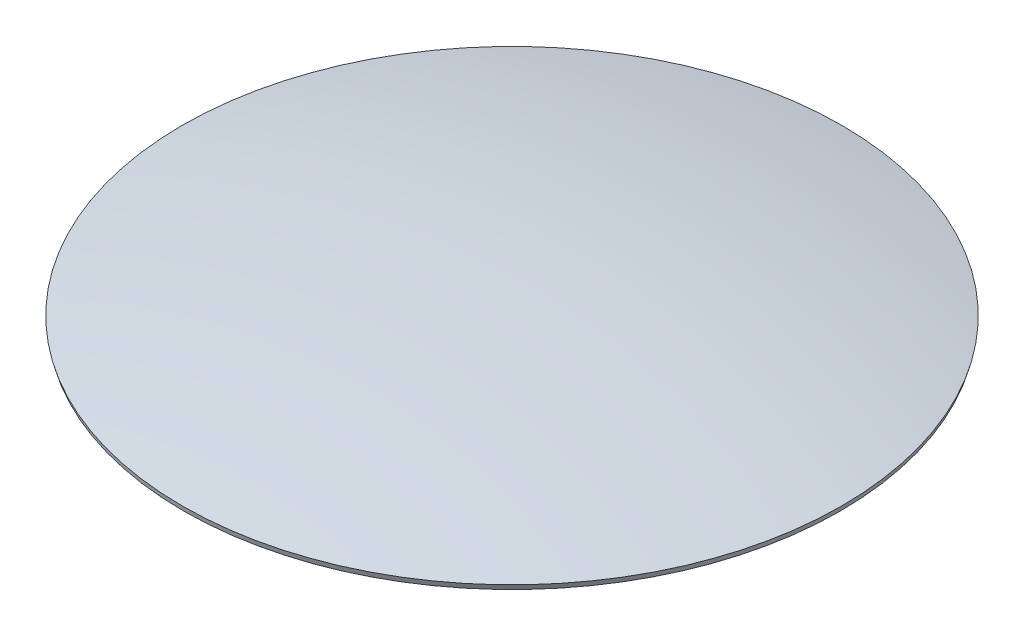
ISO-10303-21;
HEADER;
FILE_DESCRIPTION(('STEP AP214'),'2;1');
FILE_NAME('part.step','',(''),(''),'','','');
FILE_SCHEMA(('AUTOMOTIVE_DESIGN { 1 0 10303 214 1 1 1 1 }'));
ENDSEC;
DATA;
#1=APPLICATION_CONTEXT('core data for automotive mechanical design processes');
#2=APPLICATION_PROTOCOL_DEFINITION('international standard','automotive_design',2000,#1);
#3=PRODUCT_CONTEXT('',#1,'mechanical');
#4=PRODUCT('Part','Part','',(#3));
#5=PRODUCT_RELATED_PRODUCT_CATEGORY('part','',(#4));
#6=PRODUCT_DEFINITION_FORMATION('','',#4);
#7=PRODUCT_DEFINITION_CONTEXT('part definition',#1,'design');
#8=PRODUCT_DEFINITION('design','',#6,#7);
#9=PRODUCT_DEFINITION_SHAPE('','',#8);
#10=(LENGTH_UNIT() NAMED_UNIT(*) SI_UNIT(.MILLI.,.METRE.));
#11=(NAMED_UNIT(*) PLANE_ANGLE_UNIT() SI_UNIT($,.RADIAN.));
#12=(NAMED_UNIT(*) SI_UNIT($,.STERADIAN.) SOLID_ANGLE_UNIT());
#13=UNCERTAINTY_MEASURE_WITH_UNIT(LENGTH_MEASURE(1.E-05),#10,'distance_accuracy_value','');
#14=(GEOMETRIC_REPRESENTATION_CONTEXT(3) GLOBAL_UNCERTAINTY_ASSIGNED_CONTEXT((#13)) GLOBAL_UNIT_ASSIGNED_CONTEXT((#10,
#11,#12)) REPRESENTATION_CONTEXT('',''));
#15=CARTESIAN_POINT('',(0.,0.,0.));
#16=DIRECTION('',(0.,0.,1.));
#17=DIRECTION('',(1.,0.,0.));
#18=AXIS2_PLACEMENT_3D('',#15,#16,#17);
#19=CARTESIAN_POINT('',(2.48262528670497,-0.295660525934713,-2.54875205660453));
#20=CARTESIAN_POINT('',(2.45888168869753,-0.290253927583229,-2.54875205660453));
#21=CARTESIAN_POINT('',(2.4351380906901,-0.284847329231744,-2.54875205660453));
#22=CARTESIAN_POINT('',(0.,0.269652186075033,-2.54875205660453));
#23=CARTESIAN_POINT('',(-2.4351380906901,-0.284847329231742,-2.54875205660453));
#24=CARTESIAN_POINT('',(-2.45888168869753,-0.290253927583227,-2.54875205660453));
#25=CARTESIAN_POINT('',(-2.48262528670497,-0.295660525934711,-2.54875205660453));
#26=CARTESIAN_POINT('',(2.48388168869753,-0.290253927583229,-2.52437602830227));
#27=CARTESIAN_POINT('',(2.46012607457796,-0.284844593071367,-2.52437602830227));
#28=CARTESIAN_POINT('',(2.43637046045838,-0.279435258559505,-2.52437602830227));
#29=CARTESIAN_POINT('',(0.,0.275344876742419,-2.52437602830227));
#30=CARTESIAN_POINT('',(-2.43637046045838,-0.279435258559503,-2.52437602830227));
#31=CARTESIAN_POINT('',(-2.46012607457796,-0.284844593071365,-2.52437602830227));
#32=CARTESIAN_POINT('',(-2.48388168869753,-0.290253927583227,-2.52437602830227));
#33=CARTESIAN_POINT('',(2.4851380906901,-0.284847329231744,-2.5));
#34=CARTESIAN_POINT('',(2.46137046045838,-0.279435258559505,-2.5));
#35=CARTESIAN_POINT('',(2.43760283022666,-0.274023187887265,-2.5));
#36=CARTESIAN_POINT('',(0.,0.281037567409806,-2.5));
#37=CARTESIAN_POINT('',(-2.43760283022666,-0.274023187887263,-2.5));
#38=CARTESIAN_POINT('',(-2.46137046045838,-0.279435258559503,-2.5));
#39=CARTESIAN_POINT('',(-2.4851380906901,-0.284847329231742,-2.5));
#40=CARTESIAN_POINT('',(2.61399439748715,0.269652186075033,0.));
#41=CARTESIAN_POINT('',(2.58899439748716,0.275344876742419,0.));
#42=CARTESIAN_POINT('',(2.56399439748715,0.281037567409806,0.));
#43=CARTESIAN_POINT('',(0.,0.864878646522083,0.));
#44=CARTESIAN_POINT('',(-2.56399439748715,0.281037567409808,0.));
#45=CARTESIAN_POINT('',(-2.58899439748715,0.275344876742421,0.));
#46=CARTESIAN_POINT('',(-2.61399439748715,0.269652186075035,0.));
#47=CARTESIAN_POINT('',(2.4851380906901,-0.284847329231744,2.5));
#48=CARTESIAN_POINT('',(2.46137046045838,-0.279435258559505,2.5));
#49=CARTESIAN_POINT('',(2.43760283022666,-0.274023187887265,2.5));
#50=CARTESIAN_POINT('',(0.,0.281037567409806,2.5));
#51=CARTESIAN_POINT('',(-2.43760283022666,-0.274023187887263,2.5));
#52=CARTESIAN_POINT('',(-2.46137046045838,-0.279435258559503,2.5));
#53=CARTESIAN_POINT('',(-2.4851380906901,-0.284847329231742,2.5));
#54=CARTESIAN_POINT('',(2.48388168869753,-0.290253927583229,2.52437602830227));
#55=CARTESIAN_POINT('',(2.46012607457796,-0.284844593071367,2.52437602830227));
#56=CARTESIAN_POINT('',(2.43637046045838,-0.279435258559505,2.52437602830227));
#57=CARTESIAN_POINT('',(0.,0.275344876742419,2.52437602830227));
#58=CARTESIAN_POINT('',(-2.43637046045838,-0.279435258559503,2.52437602830227));
#59=CARTESIAN_POINT('',(-2.46012607457796,-0.284844593071365,2.52437602830227));
#60=CARTESIAN_POINT('',(-2.48388168869753,-0.290253927583227,2.52437602830227));
#61=CARTESIAN_POINT('',(2.48262528670497,-0.295660525934713,2.54875205660453));
#62=CARTESIAN_POINT('',(2.45888168869753,-0.290253927583229,2.54875205660453));
#63=CARTESIAN_POINT('',(2.4351380906901,-0.284847329231744,2.54875205660453));
#64=CARTESIAN_POINT('',(0.,0.269652186075033,2.54875205660453));
#65=CARTESIAN_POINT('',(-2.4351380906901,-0.284847329231742,2.54875205660453));
#66=CARTESIAN_POINT('',(-2.45888168869753,-0.290253927583227,2.54875205660453));
#67=CARTESIAN_POINT('',(-2.48262528670497,-0.295660525934711,2.54875205660453));
#68=(BOUNDED_SURFACE() B_SPLINE_SURFACE(2,2,((#19,#20,#21,#22,#23,#24,#25),(#26,#27,#28,#29,#30,
#31,#32),(#33,#34,#35,#36,#37,#38,#39),(#40,#41,#42,#43,#44,#45,#46),(#47,#48,#49,#50,#51,#52,
#53),(#54,#55,#56,#57,#58,#59,#60),(#61,#62,#63,#64,#65,#66,#67)),.UNSPECIFIED.,.F.,.F.,
.F.) B_SPLINE_SURFACE_WITH_KNOTS((3,2,2,3),(3,2,2,3),(-0.228367903217967,-0.223890101194085,
0.223890101194085,0.228367903217967),(-0.00447780202388171,0.,0.447780202388171,
0.452258004412053),
.UNSPECIFIED.) GEOMETRIC_REPRESENTATION_ITEM() RATIONAL_B_SPLINE_SURFACE(((1.,1.,1.,
0.975041132090666,1.,1.,1.),(1.,1.,1.,0.975041132090666,1.,1.,1.),(1.,1.,1.,0.975041132090666,
1.,1.,1.),(0.975041132090668,0.975041132090668,0.975041132090668,0.950705209268649,
0.975041132090668,0.975041132090668,0.975041132090668),(1.,1.,1.,0.975041132090666,1.,1.,1.),
(1.,1.,1.,0.975041132090666,1.,1.,1.),(1.,1.,1.,0.975041132090666,1.,1.,1.))) REPRESENTATION_ITEM('') SURFACE());
#69=CARTESIAN_POINT('',(0.,0.,0.));
#70=DIRECTION('',(0.,1.,0.));
#71=DIRECTION('',(0.,0.,1.));
#72=AXIS2_PLACEMENT_3D('',#69,#70,#71);
#73=CIRCLE('',#72,2.49999999999977);
#74=CARTESIAN_POINT('',(0.,0.,2.49999999999977));
#75=VERTEX_POINT('',#74);
#76=EDGE_CURVE('E20',#75,#75,#73,.T.);
#77=ORIENTED_EDGE('',*,*,#76,.F.);
#78=EDGE_LOOP('',(#77));
#79=FACE_BOUND('',#78,.T.);
#80=ADVANCED_FACE('F15',(#79),#68,.T.);
#81=CARTESIAN_POINT('',(0.,0.038637033071609,0.));
#82=DIRECTION('',(0.,1.,0.));
#83=DIRECTION('',(0.,0.,1.));
#84=AXIS2_PLACEMENT_3D('',#81,#82,#83);
#85=CONICAL_SURFACE('',#84,2.51035276178868,0.261799387302714);
#86=CARTESIAN_POINT('',(0.,0.038637033071609,0.));
#87=DIRECTION('',(0.,1.,0.));
#88=DIRECTION('',(0.,0.,1.));
#89=AXIS2_PLACEMENT_3D('',#86,#87,#88);
#90=CIRCLE('',#89,2.51035276178868);
#91=CARTESIAN_POINT('',(0.,0.038637033071609,2.51035276178868));
#92=VERTEX_POINT('',#91);
#93=EDGE_CURVE('E10',#92,#92,#90,.T.);
#94=ORIENTED_EDGE('',*,*,#93,.F.);
#95=EDGE_LOOP('',(#94));
#96=FACE_BOUND('',#95,.T.);
#97=ORIENTED_EDGE('',*,*,#76,.T.);
#98=EDGE_LOOP('',(#97));
#99=FACE_BOUND('',#98,.T.);
#100=ADVANCED_FACE('F32',(#96,#99),#85,.T.);
#101=CARTESIAN_POINT('',(0.,-10.9789910697346,0.));
#102=DIRECTION('',(1.,0.,0.));
#103=DIRECTION('',(0.,1.,0.));
#104=AXIS2_PLACEMENT_3D('',#101,#102,#103);
#105=SPHERICAL_SURFACE('',#104,11.3);
#106=ORIENTED_EDGE('',*,*,#93,.T.);
#107=EDGE_LOOP('',(#106));
#108=FACE_BOUND('',#107,.T.);
#109=ADVANCED_FACE('F30',(#108),#105,.T.);
#110=CLOSED_SHELL('',(#80,#100,#109));
#111=MANIFOLD_SOLID_BREP('B1',#110);
#112=ADVANCED_BREP_SHAPE_REPRESENTATION('',(#18,#111),#14);
#113=SHAPE_DEFINITION_REPRESENTATION(#9,#112);
ENDSEC;
END-ISO-10303-21;
